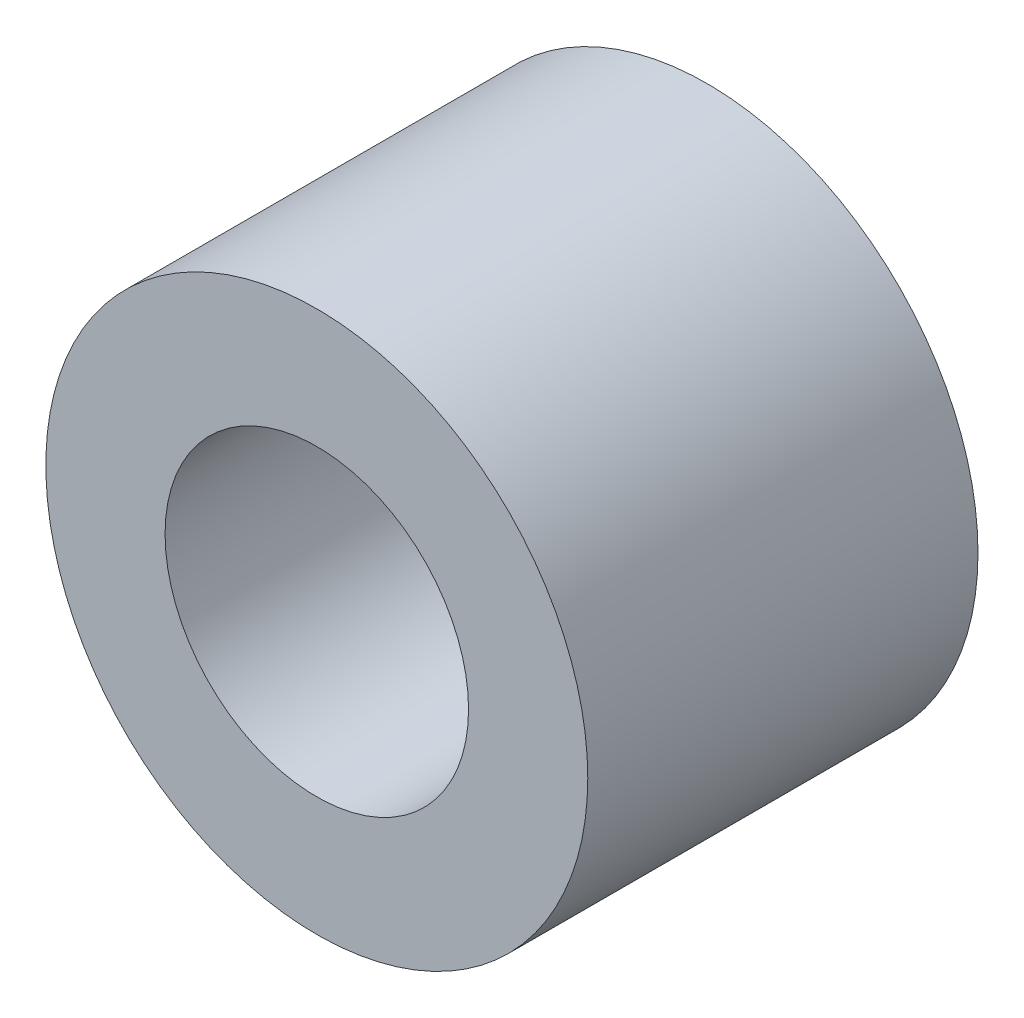
ISO-10303-21;
HEADER;
FILE_DESCRIPTION(('STEP AP214'),'2;1');
FILE_NAME('part.step','',(''),(''),'','','');
FILE_SCHEMA(('AUTOMOTIVE_DESIGN { 1 0 10303 214 1 1 1 1 }'));
ENDSEC;
DATA;
#1=APPLICATION_CONTEXT('core data for automotive mechanical design processes');
#2=APPLICATION_PROTOCOL_DEFINITION('international standard','automotive_design',2000,#1);
#3=PRODUCT_CONTEXT('',#1,'mechanical');
#4=PRODUCT('Part','Part','',(#3));
#5=PRODUCT_RELATED_PRODUCT_CATEGORY('part','',(#4));
#6=PRODUCT_DEFINITION_FORMATION('','',#4);
#7=PRODUCT_DEFINITION_CONTEXT('part definition',#1,'design');
#8=PRODUCT_DEFINITION('design','',#6,#7);
#9=PRODUCT_DEFINITION_SHAPE('','',#8);
#10=(LENGTH_UNIT() NAMED_UNIT(*) SI_UNIT(.MILLI.,.METRE.));
#11=(NAMED_UNIT(*) PLANE_ANGLE_UNIT() SI_UNIT($,.RADIAN.));
#12=(NAMED_UNIT(*) SI_UNIT($,.STERADIAN.) SOLID_ANGLE_UNIT());
#13=UNCERTAINTY_MEASURE_WITH_UNIT(LENGTH_MEASURE(1.E-05),#10,'distance_accuracy_value','');
#14=(GEOMETRIC_REPRESENTATION_CONTEXT(3) GLOBAL_UNCERTAINTY_ASSIGNED_CONTEXT((#13)) GLOBAL_UNIT_ASSIGNED_CONTEXT((#10,
#11,#12)) REPRESENTATION_CONTEXT('',''));
#15=CARTESIAN_POINT('',(0.,0.,0.));
#16=DIRECTION('',(0.,0.,1.));
#17=DIRECTION('',(1.,0.,0.));
#18=AXIS2_PLACEMENT_3D('',#15,#16,#17);
#19=CARTESIAN_POINT('',(0.,0.,12.573));
#20=DIRECTION('',(0.,0.,1.));
#21=DIRECTION('',(1.,0.,0.));
#22=AXIS2_PLACEMENT_3D('',#19,#20,#21);
#23=PLANE('',#22);
#24=CARTESIAN_POINT('',(0.,0.,12.573));
#25=DIRECTION('',(0.,0.,1.));
#26=DIRECTION('',(1.,0.,0.));
#27=AXIS2_PLACEMENT_3D('',#24,#25,#26);
#28=CIRCLE('',#27,8.73125);
#29=CARTESIAN_POINT('',(8.73125,0.,12.573));
#30=VERTEX_POINT('',#29);
#31=EDGE_CURVE('E10',#30,#30,#28,.T.);
#32=ORIENTED_EDGE('',*,*,#31,.T.);
#33=EDGE_LOOP('',(#32));
#34=FACE_BOUND('',#33,.T.);
#35=CARTESIAN_POINT('',(0.,0.,12.573));
#36=DIRECTION('',(0.,0.,1.));
#37=DIRECTION('',(1.,0.,0.));
#38=AXIS2_PLACEMENT_3D('',#35,#36,#37);
#39=CIRCLE('',#38,4.8895);
#40=CARTESIAN_POINT('',(4.8895,0.,12.573));
#41=VERTEX_POINT('',#40);
#42=EDGE_CURVE('E44',#41,#41,#39,.T.);
#43=ORIENTED_EDGE('',*,*,#42,.F.);
#44=EDGE_LOOP('',(#43));
#45=FACE_BOUND('',#44,.T.);
#46=ADVANCED_FACE('F33',(#34,#45),#23,.T.);
#47=CARTESIAN_POINT('',(0.,0.,0.));
#48=DIRECTION('',(0.,0.,1.));
#49=DIRECTION('',(1.,0.,0.));
#50=AXIS2_PLACEMENT_3D('',#47,#48,#49);
#51=PLANE('',#50);
#52=CARTESIAN_POINT('',(0.,0.,0.));
#53=DIRECTION('',(0.,0.,1.));
#54=DIRECTION('',(1.,0.,0.));
#55=AXIS2_PLACEMENT_3D('',#52,#53,#54);
#56=CIRCLE('',#55,8.73125);
#57=CARTESIAN_POINT('',(8.73125,0.,0.));
#58=VERTEX_POINT('',#57);
#59=EDGE_CURVE('E37',#58,#58,#56,.T.);
#60=ORIENTED_EDGE('',*,*,#59,.F.);
#61=EDGE_LOOP('',(#60));
#62=FACE_BOUND('',#61,.T.);
#63=CARTESIAN_POINT('',(0.,0.,0.));
#64=DIRECTION('',(0.,0.,1.));
#65=DIRECTION('',(1.,0.,0.));
#66=AXIS2_PLACEMENT_3D('',#63,#64,#65);
#67=CIRCLE('',#66,4.8895);
#68=CARTESIAN_POINT('',(4.8895,0.,0.));
#69=VERTEX_POINT('',#68);
#70=EDGE_CURVE('E46',#69,#69,#67,.T.);
#71=ORIENTED_EDGE('',*,*,#70,.T.);
#72=EDGE_LOOP('',(#71));
#73=FACE_BOUND('',#72,.T.);
#74=ADVANCED_FACE('F56',(#62,#73),#51,.F.);
#75=CARTESIAN_POINT('',(0.,0.,12.573));
#76=DIRECTION('',(0.,0.,-1.));
#77=DIRECTION('',(-1.,0.,0.));
#78=AXIS2_PLACEMENT_3D('',#75,#76,#77);
#79=CYLINDRICAL_SURFACE('',#78,8.73125);
#80=ORIENTED_EDGE('',*,*,#31,.F.);
#81=EDGE_LOOP('',(#80));
#82=FACE_BOUND('',#81,.T.);
#83=ORIENTED_EDGE('',*,*,#59,.T.);
#84=EDGE_LOOP('',(#83));
#85=FACE_BOUND('',#84,.T.);
#86=ADVANCED_FACE('F35',(#82,#85),#79,.T.);
#87=CARTESIAN_POINT('',(0.,0.,12.573));
#88=DIRECTION('',(0.,0.,-1.));
#89=DIRECTION('',(-1.,0.,0.));
#90=AXIS2_PLACEMENT_3D('',#87,#88,#89);
#91=CYLINDRICAL_SURFACE('',#90,4.8895);
#92=ORIENTED_EDGE('',*,*,#42,.T.);
#93=EDGE_LOOP('',(#92));
#94=FACE_BOUND('',#93,.T.);
#95=ORIENTED_EDGE('',*,*,#70,.F.);
#96=EDGE_LOOP('',(#95));
#97=FACE_BOUND('',#96,.T.);
#98=ADVANCED_FACE('F52',(#94,#97),#91,.F.);
#99=CLOSED_SHELL('',(#46,#74,#86,#98));
#100=MANIFOLD_SOLID_BREP('B2',#99);
#101=ADVANCED_BREP_SHAPE_REPRESENTATION('',(#18,#100),#14);
#102=SHAPE_DEFINITION_REPRESENTATION(#9,#101);
ENDSEC;
END-ISO-10303-21;
